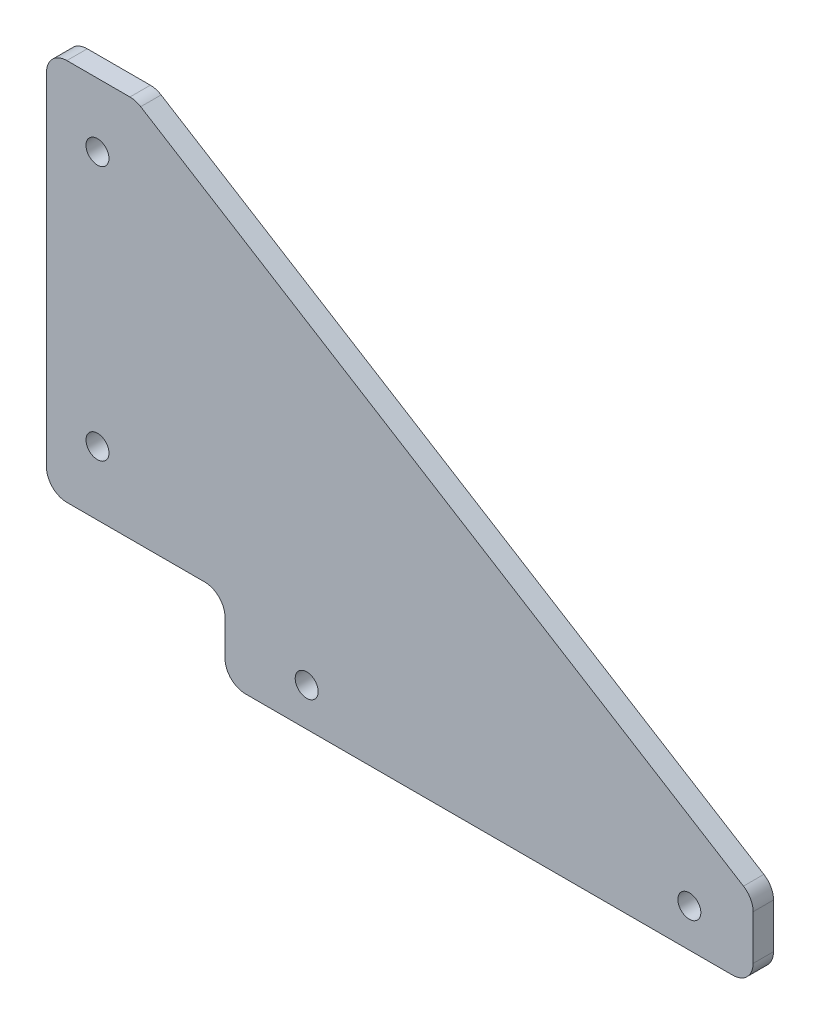
ISO-10303-21;
HEADER;
FILE_DESCRIPTION(('STEP AP214'),'2;1');
FILE_NAME('part.step','',(''),(''),'','','');
FILE_SCHEMA(('AUTOMOTIVE_DESIGN { 1 0 10303 214 1 1 1 1 }'));
ENDSEC;
DATA;
#1=APPLICATION_CONTEXT('core data for automotive mechanical design processes');
#2=APPLICATION_PROTOCOL_DEFINITION('international standard','automotive_design',2000,#1);
#3=PRODUCT_CONTEXT('',#1,'mechanical');
#4=PRODUCT('Part','Part','',(#3));
#5=PRODUCT_RELATED_PRODUCT_CATEGORY('part','',(#4));
#6=PRODUCT_DEFINITION_FORMATION('','',#4);
#7=PRODUCT_DEFINITION_CONTEXT('part definition',#1,'design');
#8=PRODUCT_DEFINITION('design','',#6,#7);
#9=PRODUCT_DEFINITION_SHAPE('','',#8);
#10=(LENGTH_UNIT() NAMED_UNIT(*) SI_UNIT(.MILLI.,.METRE.));
#11=(NAMED_UNIT(*) PLANE_ANGLE_UNIT() SI_UNIT($,.RADIAN.));
#12=(NAMED_UNIT(*) SI_UNIT($,.STERADIAN.) SOLID_ANGLE_UNIT());
#13=UNCERTAINTY_MEASURE_WITH_UNIT(LENGTH_MEASURE(1.E-05),#10,'distance_accuracy_value','');
#14=(GEOMETRIC_REPRESENTATION_CONTEXT(3) GLOBAL_UNCERTAINTY_ASSIGNED_CONTEXT((#13)) GLOBAL_UNIT_ASSIGNED_CONTEXT((#10,
#11,#12)) REPRESENTATION_CONTEXT('',''));
#15=CARTESIAN_POINT('',(0.,0.,0.));
#16=DIRECTION('',(0.,0.,1.));
#17=DIRECTION('',(1.,0.,0.));
#18=AXIS2_PLACEMENT_3D('',#15,#16,#17);
#19=CARTESIAN_POINT('',(-86.6689221257626,123.251708428246,8.));
#20=DIRECTION('',(0.,0.,-1.));
#21=DIRECTION('',(-1.,0.,0.));
#22=AXIS2_PLACEMENT_3D('',#19,#20,#21);
#23=PLANE('',#22);
#24=CARTESIAN_POINT('',(-86.6689221257626,123.251708428246,8.));
#25=DIRECTION('',(0.,0.,1.));
#26=DIRECTION('',(-1.,0.,0.));
#27=AXIS2_PLACEMENT_3D('',#24,#25,#26);
#28=CIRCLE('',#27,8.);
#29=CARTESIAN_POINT('',(-82.4542166522612,130.051433258828,8.));
#30=VERTEX_POINT('',#29);
#31=CARTESIAN_POINT('',(-86.6689221257626,131.251708428246,8.));
#32=VERTEX_POINT('',#31);
#33=EDGE_CURVE('E192',#30,#32,#28,.T.);
#34=ORIENTED_EDGE('',*,*,#33,.T.);
#35=DIRECTION('',(-1.,0.,0.));
#36=VECTOR('',#35,1.);
#37=CARTESIAN_POINT('',(-86.6689221257626,131.251708428246,8.));
#38=LINE('',#37,#36);
#39=CARTESIAN_POINT('',(-111.390660592255,131.251708428246,8.));
#40=VERTEX_POINT('',#39);
#41=EDGE_CURVE('E110',#32,#40,#38,.T.);
#42=ORIENTED_EDGE('',*,*,#41,.T.);
#43=CARTESIAN_POINT('',(-111.390660592255,123.251708428246,8.));
#44=DIRECTION('',(0.,0.,1.));
#45=DIRECTION('',(-1.,0.,0.));
#46=AXIS2_PLACEMENT_3D('',#43,#44,#45);
#47=CIRCLE('',#46,8.);
#48=CARTESIAN_POINT('',(-119.390660592255,123.251708428246,8.));
#49=VERTEX_POINT('',#48);
#50=EDGE_CURVE('E225',#40,#49,#47,.T.);
#51=ORIENTED_EDGE('',*,*,#50,.T.);
#52=DIRECTION('',(0.,-1.,0.));
#53=VECTOR('',#52,1.);
#54=CARTESIAN_POINT('',(-119.390660592255,123.251708428246,8.));
#55=LINE('',#54,#53);
#56=CARTESIAN_POINT('',(-119.390660592255,-10.748291571754,8.));
#57=VERTEX_POINT('',#56);
#58=EDGE_CURVE('E244',#49,#57,#55,.T.);
#59=ORIENTED_EDGE('',*,*,#58,.T.);
#60=CARTESIAN_POINT('',(-111.390660592255,-10.748291571754,8.));
#61=DIRECTION('',(0.,0.,1.));
#62=DIRECTION('',(-1.,0.,0.));
#63=AXIS2_PLACEMENT_3D('',#60,#61,#62);
#64=CIRCLE('',#63,8.00000000000001);
#65=CARTESIAN_POINT('',(-111.390660592255,-18.748291571754,8.));
#66=VERTEX_POINT('',#65);
#67=EDGE_CURVE('E241',#57,#66,#64,.T.);
#68=ORIENTED_EDGE('',*,*,#67,.T.);
#69=DIRECTION('',(1.,0.,0.));
#70=VECTOR('',#69,1.);
#71=CARTESIAN_POINT('',(-111.390660592255,-18.748291571754,8.));
#72=LINE('',#71,#70);
#73=CARTESIAN_POINT('',(-57.3906605922552,-18.748291571754,8.));
#74=VERTEX_POINT('',#73);
#75=EDGE_CURVE('E243',#66,#74,#72,.T.);
#76=ORIENTED_EDGE('',*,*,#75,.T.);
#77=CARTESIAN_POINT('',(-57.3906605922552,-26.748291571754,8.));
#78=DIRECTION('',(0.,0.,-1.));
#79=DIRECTION('',(1.,0.,0.));
#80=AXIS2_PLACEMENT_3D('',#77,#78,#79);
#81=CIRCLE('',#80,8.);
#82=CARTESIAN_POINT('',(-49.3906605922552,-26.748291571754,8.));
#83=VERTEX_POINT('',#82);
#84=EDGE_CURVE('E246',#74,#83,#81,.T.);
#85=ORIENTED_EDGE('',*,*,#84,.T.);
#86=DIRECTION('',(0.,-1.,0.));
#87=VECTOR('',#86,1.);
#88=CARTESIAN_POINT('',(-49.3906605922552,-26.748291571754,8.));
#89=LINE('',#88,#87);
#90=CARTESIAN_POINT('',(-49.3906605922552,-40.748291571754,8.));
#91=VERTEX_POINT('',#90);
#92=EDGE_CURVE('E252',#83,#91,#89,.T.);
#93=ORIENTED_EDGE('',*,*,#92,.T.);
#94=CARTESIAN_POINT('',(-41.3906605922551,-40.748291571754,8.));
#95=DIRECTION('',(0.,0.,1.));
#96=DIRECTION('',(-1.,0.,0.));
#97=AXIS2_PLACEMENT_3D('',#94,#95,#96);
#98=CIRCLE('',#97,8.);
#99=CARTESIAN_POINT('',(-41.3906605922551,-48.748291571754,8.));
#100=VERTEX_POINT('',#99);
#101=EDGE_CURVE('E254',#91,#100,#98,.T.);
#102=ORIENTED_EDGE('',*,*,#101,.T.);
#103=DIRECTION('',(1.,0.,0.));
#104=VECTOR('',#103,1.);
#105=CARTESIAN_POINT('',(-41.3906605922551,-48.748291571754,8.));
#106=LINE('',#105,#104);
#107=CARTESIAN_POINT('',(149.609339407745,-48.748291571754,8.));
#108=VERTEX_POINT('',#107);
#109=EDGE_CURVE('E256',#100,#108,#106,.T.);
#110=ORIENTED_EDGE('',*,*,#109,.T.);
#111=CARTESIAN_POINT('',(149.609339407745,-40.748291571754,8.));
#112=DIRECTION('',(0.,0.,1.));
#113=DIRECTION('',(-1.,0.,0.));
#114=AXIS2_PLACEMENT_3D('',#111,#112,#113);
#115=CIRCLE('',#114,8.);
#116=CARTESIAN_POINT('',(157.609339407745,-40.7482915717539,8.));
#117=VERTEX_POINT('',#116);
#118=EDGE_CURVE('E147',#108,#117,#115,.T.);
#119=ORIENTED_EDGE('',*,*,#118,.T.);
#120=DIRECTION('',(0.,1.,0.));
#121=VECTOR('',#120,1.);
#122=CARTESIAN_POINT('',(157.609339407745,-40.7482915717539,8.));
#123=LINE('',#122,#121);
#124=CARTESIAN_POINT('',(157.609339407745,-23.2017594644239,8.));
#125=VERTEX_POINT('',#124);
#126=EDGE_CURVE('E141',#117,#125,#123,.T.);
#127=ORIENTED_EDGE('',*,*,#126,.T.);
#128=CARTESIAN_POINT('',(149.609339407745,-23.2017594644239,8.));
#129=DIRECTION('',(0.,0.,1.));
#130=DIRECTION('',(-1.,0.,0.));
#131=AXIS2_PLACEMENT_3D('',#128,#129,#130);
#132=CIRCLE('',#131,7.99999999999999);
#133=CARTESIAN_POINT('',(153.824044881246,-16.4020346338417,8.));
#134=VERTEX_POINT('',#133);
#135=EDGE_CURVE('E145',#125,#134,#132,.T.);
#136=ORIENTED_EDGE('',*,*,#135,.T.);
#137=DIRECTION('',(-0.849965603822785,0.526838184187677,0.));
#138=VECTOR('',#137,1.);
#139=CARTESIAN_POINT('',(153.824044881246,-16.4020346338417,8.));
#140=LINE('',#139,#138);
#141=EDGE_CURVE('E49',#134,#30,#140,.T.);
#142=ORIENTED_EDGE('',*,*,#141,.T.);
#143=EDGE_LOOP('',(#34,#42,#51,#59,#68,#76,#85,#93,#102,#110,#119,#127,#136,#142));
#144=FACE_BOUND('',#143,.T.);
#145=CARTESIAN_POINT('',(-99.3906605922552,106.251708428246,8.));
#146=DIRECTION('',(0.,0.,1.));
#147=DIRECTION('',(1.,0.,0.));
#148=AXIS2_PLACEMENT_3D('',#145,#146,#147);
#149=CIRCLE('',#148,4.50000000000001);
#150=CARTESIAN_POINT('',(-94.8906605922552,106.251708428246,8.));
#151=VERTEX_POINT('',#150);
#152=EDGE_CURVE('E169',#151,#151,#149,.T.);
#153=ORIENTED_EDGE('',*,*,#152,.F.);
#154=EDGE_LOOP('',(#153));
#155=FACE_BOUND('',#154,.T.);
#156=CARTESIAN_POINT('',(-99.3906605922552,6.25170842824602,8.));
#157=DIRECTION('',(0.,0.,1.));
#158=DIRECTION('',(1.,0.,0.));
#159=AXIS2_PLACEMENT_3D('',#156,#157,#158);
#160=CIRCLE('',#159,4.5);
#161=CARTESIAN_POINT('',(-94.8906605922551,6.25170842824602,8.));
#162=VERTEX_POINT('',#161);
#163=EDGE_CURVE('E320',#162,#162,#160,.T.);
#164=ORIENTED_EDGE('',*,*,#163,.F.);
#165=EDGE_LOOP('',(#164));
#166=FACE_BOUND('',#165,.T.);
#167=CARTESIAN_POINT('',(-17.3906605922552,-33.748291571754,8.));
#168=DIRECTION('',(0.,0.,1.));
#169=DIRECTION('',(1.,0.,0.));
#170=AXIS2_PLACEMENT_3D('',#167,#168,#169);
#171=CIRCLE('',#170,4.50000000000001);
#172=CARTESIAN_POINT('',(-12.8906605922552,-33.748291571754,8.));
#173=VERTEX_POINT('',#172);
#174=EDGE_CURVE('E314',#173,#173,#171,.T.);
#175=ORIENTED_EDGE('',*,*,#174,.F.);
#176=EDGE_LOOP('',(#175));
#177=FACE_BOUND('',#176,.T.);
#178=CARTESIAN_POINT('',(132.609339407745,-33.748291571754,8.));
#179=DIRECTION('',(0.,0.,1.));
#180=DIRECTION('',(1.,0.,0.));
#181=AXIS2_PLACEMENT_3D('',#178,#179,#180);
#182=CIRCLE('',#181,4.49999999999996);
#183=CARTESIAN_POINT('',(137.109339407745,-33.748291571754,8.));
#184=VERTEX_POINT('',#183);
#185=EDGE_CURVE('E305',#184,#184,#182,.T.);
#186=ORIENTED_EDGE('',*,*,#185,.F.);
#187=EDGE_LOOP('',(#186));
#188=FACE_BOUND('',#187,.T.);
#189=ADVANCED_FACE('F32',(#144,#155,#166,#177,#188),#23,.F.);
#190=CARTESIAN_POINT('',(-86.6689221257626,123.251708428246,0.));
#191=DIRECTION('',(0.,0.,-1.));
#192=DIRECTION('',(-1.,0.,0.));
#193=AXIS2_PLACEMENT_3D('',#190,#191,#192);
#194=PLANE('',#193);
#195=CARTESIAN_POINT('',(-17.3906605922552,-33.748291571754,0.));
#196=DIRECTION('',(0.,0.,1.));
#197=DIRECTION('',(1.,0.,0.));
#198=AXIS2_PLACEMENT_3D('',#195,#196,#197);
#199=CIRCLE('',#198,4.50000000000001);
#200=CARTESIAN_POINT('',(-12.8906605922552,-33.748291571754,0.));
#201=VERTEX_POINT('',#200);
#202=EDGE_CURVE('E311',#201,#201,#199,.T.);
#203=ORIENTED_EDGE('',*,*,#202,.T.);
#204=EDGE_LOOP('',(#203));
#205=FACE_BOUND('',#204,.T.);
#206=CARTESIAN_POINT('',(-99.3906605922552,106.251708428246,0.));
#207=DIRECTION('',(0.,0.,1.));
#208=DIRECTION('',(1.,0.,0.));
#209=AXIS2_PLACEMENT_3D('',#206,#207,#208);
#210=CIRCLE('',#209,4.50000000000001);
#211=CARTESIAN_POINT('',(-94.8906605922552,106.251708428246,0.));
#212=VERTEX_POINT('',#211);
#213=EDGE_CURVE('E323',#212,#212,#210,.T.);
#214=ORIENTED_EDGE('',*,*,#213,.T.);
#215=EDGE_LOOP('',(#214));
#216=FACE_BOUND('',#215,.T.);
#217=CARTESIAN_POINT('',(-86.6689221257626,123.251708428246,0.));
#218=DIRECTION('',(0.,0.,1.));
#219=DIRECTION('',(-1.,0.,0.));
#220=AXIS2_PLACEMENT_3D('',#217,#218,#219);
#221=CIRCLE('',#220,8.);
#222=CARTESIAN_POINT('',(-82.4542166522612,130.051433258828,0.));
#223=VERTEX_POINT('',#222);
#224=CARTESIAN_POINT('',(-86.6689221257626,131.251708428246,0.));
#225=VERTEX_POINT('',#224);
#226=EDGE_CURVE('E165',#223,#225,#221,.T.);
#227=ORIENTED_EDGE('',*,*,#226,.F.);
#228=DIRECTION('',(-0.849965603822785,0.526838184187677,0.));
#229=VECTOR('',#228,1.);
#230=CARTESIAN_POINT('',(153.824044881246,-16.4020346338417,0.));
#231=LINE('',#230,#229);
#232=CARTESIAN_POINT('',(153.824044881246,-16.4020346338417,0.));
#233=VERTEX_POINT('',#232);
#234=EDGE_CURVE('E102',#233,#223,#231,.T.);
#235=ORIENTED_EDGE('',*,*,#234,.F.);
#236=CARTESIAN_POINT('',(149.609339407745,-23.2017594644239,0.));
#237=DIRECTION('',(0.,0.,1.));
#238=DIRECTION('',(-1.,0.,0.));
#239=AXIS2_PLACEMENT_3D('',#236,#237,#238);
#240=CIRCLE('',#239,7.99999999999999);
#241=CARTESIAN_POINT('',(157.609339407745,-23.2017594644239,0.));
#242=VERTEX_POINT('',#241);
#243=EDGE_CURVE('E96',#242,#233,#240,.T.);
#244=ORIENTED_EDGE('',*,*,#243,.F.);
#245=DIRECTION('',(0.,1.,0.));
#246=VECTOR('',#245,1.);
#247=CARTESIAN_POINT('',(157.609339407745,-40.7482915717539,0.));
#248=LINE('',#247,#246);
#249=CARTESIAN_POINT('',(157.609339407745,-40.7482915717539,0.));
#250=VERTEX_POINT('',#249);
#251=EDGE_CURVE('E155',#250,#242,#248,.T.);
#252=ORIENTED_EDGE('',*,*,#251,.F.);
#253=CARTESIAN_POINT('',(149.609339407745,-40.748291571754,0.));
#254=DIRECTION('',(0.,0.,1.));
#255=DIRECTION('',(-1.,0.,0.));
#256=AXIS2_PLACEMENT_3D('',#253,#254,#255);
#257=CIRCLE('',#256,8.);
#258=CARTESIAN_POINT('',(149.609339407745,-48.748291571754,0.));
#259=VERTEX_POINT('',#258);
#260=EDGE_CURVE('E187',#259,#250,#257,.T.);
#261=ORIENTED_EDGE('',*,*,#260,.F.);
#262=DIRECTION('',(1.,0.,0.));
#263=VECTOR('',#262,1.);
#264=CARTESIAN_POINT('',(-41.3906605922551,-48.748291571754,0.));
#265=LINE('',#264,#263);
#266=CARTESIAN_POINT('',(-41.3906605922551,-48.748291571754,0.));
#267=VERTEX_POINT('',#266);
#268=EDGE_CURVE('E185',#267,#259,#265,.T.);
#269=ORIENTED_EDGE('',*,*,#268,.F.);
#270=CARTESIAN_POINT('',(-41.3906605922551,-40.748291571754,0.));
#271=DIRECTION('',(0.,0.,1.));
#272=DIRECTION('',(-1.,0.,0.));
#273=AXIS2_PLACEMENT_3D('',#270,#271,#272);
#274=CIRCLE('',#273,8.);
#275=CARTESIAN_POINT('',(-49.3906605922552,-40.748291571754,0.));
#276=VERTEX_POINT('',#275);
#277=EDGE_CURVE('E183',#276,#267,#274,.T.);
#278=ORIENTED_EDGE('',*,*,#277,.F.);
#279=DIRECTION('',(0.,-1.,0.));
#280=VECTOR('',#279,1.);
#281=CARTESIAN_POINT('',(-49.3906605922552,-26.748291571754,0.));
#282=LINE('',#281,#280);
#283=CARTESIAN_POINT('',(-49.3906605922552,-26.748291571754,0.));
#284=VERTEX_POINT('',#283);
#285=EDGE_CURVE('E181',#284,#276,#282,.T.);
#286=ORIENTED_EDGE('',*,*,#285,.F.);
#287=CARTESIAN_POINT('',(-57.3906605922552,-26.748291571754,0.));
#288=DIRECTION('',(0.,0.,-1.));
#289=DIRECTION('',(1.,0.,0.));
#290=AXIS2_PLACEMENT_3D('',#287,#288,#289);
#291=CIRCLE('',#290,8.);
#292=CARTESIAN_POINT('',(-57.3906605922552,-18.748291571754,0.));
#293=VERTEX_POINT('',#292);
#294=EDGE_CURVE('E179',#293,#284,#291,.T.);
#295=ORIENTED_EDGE('',*,*,#294,.F.);
#296=DIRECTION('',(1.,0.,0.));
#297=VECTOR('',#296,1.);
#298=CARTESIAN_POINT('',(-111.390660592255,-18.748291571754,0.));
#299=LINE('',#298,#297);
#300=CARTESIAN_POINT('',(-111.390660592255,-18.748291571754,0.));
#301=VERTEX_POINT('',#300);
#302=EDGE_CURVE('E177',#301,#293,#299,.T.);
#303=ORIENTED_EDGE('',*,*,#302,.F.);
#304=CARTESIAN_POINT('',(-111.390660592255,-10.748291571754,0.));
#305=DIRECTION('',(0.,0.,1.));
#306=DIRECTION('',(-1.,0.,0.));
#307=AXIS2_PLACEMENT_3D('',#304,#305,#306);
#308=CIRCLE('',#307,8.00000000000001);
#309=CARTESIAN_POINT('',(-119.390660592255,-10.748291571754,0.));
#310=VERTEX_POINT('',#309);
#311=EDGE_CURVE('E175',#310,#301,#308,.T.);
#312=ORIENTED_EDGE('',*,*,#311,.F.);
#313=DIRECTION('',(0.,-1.,0.));
#314=VECTOR('',#313,1.);
#315=CARTESIAN_POINT('',(-119.390660592255,123.251708428246,0.));
#316=LINE('',#315,#314);
#317=CARTESIAN_POINT('',(-119.390660592255,123.251708428246,0.));
#318=VERTEX_POINT('',#317);
#319=EDGE_CURVE('E173',#318,#310,#316,.T.);
#320=ORIENTED_EDGE('',*,*,#319,.F.);
#321=CARTESIAN_POINT('',(-111.390660592255,123.251708428246,0.));
#322=DIRECTION('',(0.,0.,1.));
#323=DIRECTION('',(-1.,0.,0.));
#324=AXIS2_PLACEMENT_3D('',#321,#322,#323);
#325=CIRCLE('',#324,8.);
#326=CARTESIAN_POINT('',(-111.390660592255,131.251708428246,0.));
#327=VERTEX_POINT('',#326);
#328=EDGE_CURVE('E171',#327,#318,#325,.T.);
#329=ORIENTED_EDGE('',*,*,#328,.F.);
#330=DIRECTION('',(-1.,0.,0.));
#331=VECTOR('',#330,1.);
#332=CARTESIAN_POINT('',(-86.6689221257626,131.251708428246,0.));
#333=LINE('',#332,#331);
#334=EDGE_CURVE('E168',#225,#327,#333,.T.);
#335=ORIENTED_EDGE('',*,*,#334,.F.);
#336=EDGE_LOOP('',(#227,#235,#244,#252,#261,#269,#278,#286,#295,#303,#312,#320,#329,#335));
#337=FACE_BOUND('',#336,.T.);
#338=CARTESIAN_POINT('',(-99.3906605922552,6.25170842824602,0.));
#339=DIRECTION('',(0.,0.,1.));
#340=DIRECTION('',(1.,0.,0.));
#341=AXIS2_PLACEMENT_3D('',#338,#339,#340);
#342=CIRCLE('',#341,4.5);
#343=CARTESIAN_POINT('',(-94.8906605922551,6.25170842824602,0.));
#344=VERTEX_POINT('',#343);
#345=EDGE_CURVE('E317',#344,#344,#342,.T.);
#346=ORIENTED_EDGE('',*,*,#345,.T.);
#347=EDGE_LOOP('',(#346));
#348=FACE_BOUND('',#347,.T.);
#349=CARTESIAN_POINT('',(132.609339407745,-33.748291571754,0.));
#350=DIRECTION('',(0.,0.,1.));
#351=DIRECTION('',(1.,0.,0.));
#352=AXIS2_PLACEMENT_3D('',#349,#350,#351);
#353=CIRCLE('',#352,4.49999999999996);
#354=CARTESIAN_POINT('',(137.109339407745,-33.748291571754,0.));
#355=VERTEX_POINT('',#354);
#356=EDGE_CURVE('E308',#355,#355,#353,.T.);
#357=ORIENTED_EDGE('',*,*,#356,.T.);
#358=EDGE_LOOP('',(#357));
#359=FACE_BOUND('',#358,.T.);
#360=ADVANCED_FACE('F229',(#205,#216,#337,#348,#359),#194,.T.);
#361=CARTESIAN_POINT('',(-86.6689221257626,123.251708428246,8.));
#362=DIRECTION('',(0.,0.,-1.));
#363=DIRECTION('',(-1.,0.,0.));
#364=AXIS2_PLACEMENT_3D('',#361,#362,#363);
#365=CYLINDRICAL_SURFACE('',#364,8.);
#366=ORIENTED_EDGE('',*,*,#226,.T.);
#367=DIRECTION('',(0.,0.,-1.));
#368=VECTOR('',#367,1.);
#369=CARTESIAN_POINT('',(-86.6689221257626,131.251708428246,8.));
#370=LINE('',#369,#368);
#371=EDGE_CURVE('E11',#32,#225,#370,.T.);
#372=ORIENTED_EDGE('',*,*,#371,.F.);
#373=ORIENTED_EDGE('',*,*,#33,.F.);
#374=DIRECTION('',(0.,0.,-1.));
#375=VECTOR('',#374,1.);
#376=CARTESIAN_POINT('',(-82.4542166522612,130.051433258828,8.));
#377=LINE('',#376,#375);
#378=EDGE_CURVE('E161',#30,#223,#377,.T.);
#379=ORIENTED_EDGE('',*,*,#378,.T.);
#380=EDGE_LOOP('',(#366,#372,#373,#379));
#381=FACE_BOUND('',#380,.T.);
#382=ADVANCED_FACE('F34',(#381),#365,.T.);
#383=CARTESIAN_POINT('',(-86.6689221257626,131.251708428246,8.));
#384=DIRECTION('',(0.,-1.,0.));
#385=DIRECTION('',(1.,0.,0.));
#386=AXIS2_PLACEMENT_3D('',#383,#384,#385);
#387=PLANE('',#386);
#388=ORIENTED_EDGE('',*,*,#334,.T.);
#389=DIRECTION('',(0.,0.,-1.));
#390=VECTOR('',#389,1.);
#391=CARTESIAN_POINT('',(-111.390660592255,131.251708428246,8.));
#392=LINE('',#391,#390);
#393=EDGE_CURVE('E41',#40,#327,#392,.T.);
#394=ORIENTED_EDGE('',*,*,#393,.F.);
#395=ORIENTED_EDGE('',*,*,#41,.F.);
#396=ORIENTED_EDGE('',*,*,#371,.T.);
#397=EDGE_LOOP('',(#388,#394,#395,#396));
#398=FACE_BOUND('',#397,.T.);
#399=ADVANCED_FACE('F455',(#398),#387,.F.);
#400=CARTESIAN_POINT('',(-111.390660592255,123.251708428246,8.));
#401=DIRECTION('',(0.,0.,-1.));
#402=DIRECTION('',(-1.,0.,0.));
#403=AXIS2_PLACEMENT_3D('',#400,#401,#402);
#404=CYLINDRICAL_SURFACE('',#403,8.);
#405=ORIENTED_EDGE('',*,*,#328,.T.);
#406=DIRECTION('',(0.,0.,-1.));
#407=VECTOR('',#406,1.);
#408=CARTESIAN_POINT('',(-119.390660592255,123.251708428246,8.));
#409=LINE('',#408,#407);
#410=EDGE_CURVE('E217',#49,#318,#409,.T.);
#411=ORIENTED_EDGE('',*,*,#410,.F.);
#412=ORIENTED_EDGE('',*,*,#50,.F.);
#413=ORIENTED_EDGE('',*,*,#393,.T.);
#414=EDGE_LOOP('',(#405,#411,#412,#413));
#415=FACE_BOUND('',#414,.T.);
#416=ADVANCED_FACE('F223',(#415),#404,.T.);
#417=CARTESIAN_POINT('',(-119.390660592255,123.251708428246,8.));
#418=DIRECTION('',(1.,0.,0.));
#419=DIRECTION('',(0.,1.,0.));
#420=AXIS2_PLACEMENT_3D('',#417,#418,#419);
#421=PLANE('',#420);
#422=ORIENTED_EDGE('',*,*,#319,.T.);
#423=DIRECTION('',(0.,0.,-1.));
#424=VECTOR('',#423,1.);
#425=CARTESIAN_POINT('',(-119.390660592255,-10.748291571754,8.));
#426=LINE('',#425,#424);
#427=EDGE_CURVE('E214',#57,#310,#426,.T.);
#428=ORIENTED_EDGE('',*,*,#427,.F.);
#429=ORIENTED_EDGE('',*,*,#58,.F.);
#430=ORIENTED_EDGE('',*,*,#410,.T.);
#431=EDGE_LOOP('',(#422,#428,#429,#430));
#432=FACE_BOUND('',#431,.T.);
#433=ADVANCED_FACE('F235',(#432),#421,.F.);
#434=CARTESIAN_POINT('',(-111.390660592255,-10.748291571754,8.));
#435=DIRECTION('',(0.,0.,-1.));
#436=DIRECTION('',(-1.,0.,0.));
#437=AXIS2_PLACEMENT_3D('',#434,#435,#436);
#438=CYLINDRICAL_SURFACE('',#437,8.00000000000001);
#439=ORIENTED_EDGE('',*,*,#311,.T.);
#440=DIRECTION('',(0.,0.,-1.));
#441=VECTOR('',#440,1.);
#442=CARTESIAN_POINT('',(-111.390660592255,-18.748291571754,8.));
#443=LINE('',#442,#441);
#444=EDGE_CURVE('E211',#66,#301,#443,.T.);
#445=ORIENTED_EDGE('',*,*,#444,.F.);
#446=ORIENTED_EDGE('',*,*,#67,.F.);
#447=ORIENTED_EDGE('',*,*,#427,.T.);
#448=EDGE_LOOP('',(#439,#445,#446,#447));
#449=FACE_BOUND('',#448,.T.);
#450=ADVANCED_FACE('F239',(#449),#438,.T.);
#451=CARTESIAN_POINT('',(-111.390660592255,-18.748291571754,8.));
#452=DIRECTION('',(0.,1.,0.));
#453=DIRECTION('',(0.,0.,1.));
#454=AXIS2_PLACEMENT_3D('',#451,#452,#453);
#455=PLANE('',#454);
#456=ORIENTED_EDGE('',*,*,#302,.T.);
#457=DIRECTION('',(0.,0.,-1.));
#458=VECTOR('',#457,1.);
#459=CARTESIAN_POINT('',(-57.3906605922552,-18.748291571754,8.));
#460=LINE('',#459,#458);
#461=EDGE_CURVE('E208',#74,#293,#460,.T.);
#462=ORIENTED_EDGE('',*,*,#461,.F.);
#463=ORIENTED_EDGE('',*,*,#75,.F.);
#464=ORIENTED_EDGE('',*,*,#444,.T.);
#465=EDGE_LOOP('',(#456,#462,#463,#464));
#466=FACE_BOUND('',#465,.T.);
#467=ADVANCED_FACE('F420',(#466),#455,.F.);
#468=CARTESIAN_POINT('',(-57.3906605922552,-26.748291571754,8.));
#469=DIRECTION('',(0.,0.,-1.));
#470=DIRECTION('',(-1.,0.,0.));
#471=AXIS2_PLACEMENT_3D('',#468,#469,#470);
#472=CYLINDRICAL_SURFACE('',#471,8.);
#473=ORIENTED_EDGE('',*,*,#294,.T.);
#474=DIRECTION('',(0.,0.,-1.));
#475=VECTOR('',#474,1.);
#476=CARTESIAN_POINT('',(-49.3906605922552,-26.748291571754,8.));
#477=LINE('',#476,#475);
#478=EDGE_CURVE('E205',#83,#284,#477,.T.);
#479=ORIENTED_EDGE('',*,*,#478,.F.);
#480=ORIENTED_EDGE('',*,*,#84,.F.);
#481=ORIENTED_EDGE('',*,*,#461,.T.);
#482=EDGE_LOOP('',(#473,#479,#480,#481));
#483=FACE_BOUND('',#482,.T.);
#484=ADVANCED_FACE('F410',(#483),#472,.F.);
#485=CARTESIAN_POINT('',(-49.3906605922552,-26.748291571754,8.));
#486=DIRECTION('',(1.,0.,0.));
#487=DIRECTION('',(0.,0.,-1.));
#488=AXIS2_PLACEMENT_3D('',#485,#486,#487);
#489=PLANE('',#488);
#490=ORIENTED_EDGE('',*,*,#285,.T.);
#491=DIRECTION('',(0.,0.,-1.));
#492=VECTOR('',#491,1.);
#493=CARTESIAN_POINT('',(-49.3906605922552,-40.748291571754,8.));
#494=LINE('',#493,#492);
#495=EDGE_CURVE('E202',#91,#276,#494,.T.);
#496=ORIENTED_EDGE('',*,*,#495,.F.);
#497=ORIENTED_EDGE('',*,*,#92,.F.);
#498=ORIENTED_EDGE('',*,*,#478,.T.);
#499=EDGE_LOOP('',(#490,#496,#497,#498));
#500=FACE_BOUND('',#499,.T.);
#501=ADVANCED_FACE('F400',(#500),#489,.F.);
#502=CARTESIAN_POINT('',(-41.3906605922551,-40.748291571754,8.));
#503=DIRECTION('',(0.,0.,-1.));
#504=DIRECTION('',(-1.,0.,0.));
#505=AXIS2_PLACEMENT_3D('',#502,#503,#504);
#506=CYLINDRICAL_SURFACE('',#505,8.);
#507=ORIENTED_EDGE('',*,*,#277,.T.);
#508=DIRECTION('',(0.,0.,-1.));
#509=VECTOR('',#508,1.);
#510=CARTESIAN_POINT('',(-41.3906605922551,-48.748291571754,8.));
#511=LINE('',#510,#509);
#512=EDGE_CURVE('E199',#100,#267,#511,.T.);
#513=ORIENTED_EDGE('',*,*,#512,.F.);
#514=ORIENTED_EDGE('',*,*,#101,.F.);
#515=ORIENTED_EDGE('',*,*,#495,.T.);
#516=EDGE_LOOP('',(#507,#513,#514,#515));
#517=FACE_BOUND('',#516,.T.);
#518=ADVANCED_FACE('F391',(#517),#506,.T.);
#519=CARTESIAN_POINT('',(-41.3906605922551,-48.748291571754,8.));
#520=DIRECTION('',(0.,1.,0.));
#521=DIRECTION('',(0.,0.,1.));
#522=AXIS2_PLACEMENT_3D('',#519,#520,#521);
#523=PLANE('',#522);
#524=ORIENTED_EDGE('',*,*,#268,.T.);
#525=DIRECTION('',(0.,0.,-1.));
#526=VECTOR('',#525,1.);
#527=CARTESIAN_POINT('',(149.609339407745,-48.748291571754,8.));
#528=LINE('',#527,#526);
#529=EDGE_CURVE('E196',#108,#259,#528,.T.);
#530=ORIENTED_EDGE('',*,*,#529,.F.);
#531=ORIENTED_EDGE('',*,*,#109,.F.);
#532=ORIENTED_EDGE('',*,*,#512,.T.);
#533=EDGE_LOOP('',(#524,#530,#531,#532));
#534=FACE_BOUND('',#533,.T.);
#535=ADVANCED_FACE('F262',(#534),#523,.F.);
#536=CARTESIAN_POINT('',(149.609339407745,-40.748291571754,8.));
#537=DIRECTION('',(0.,0.,-1.));
#538=DIRECTION('',(-1.,0.,0.));
#539=AXIS2_PLACEMENT_3D('',#536,#537,#538);
#540=CYLINDRICAL_SURFACE('',#539,8.);
#541=ORIENTED_EDGE('',*,*,#260,.T.);
#542=DIRECTION('',(0.,0.,-1.));
#543=VECTOR('',#542,1.);
#544=CARTESIAN_POINT('',(157.609339407745,-40.7482915717539,8.));
#545=LINE('',#544,#543);
#546=EDGE_CURVE('E156',#117,#250,#545,.T.);
#547=ORIENTED_EDGE('',*,*,#546,.F.);
#548=ORIENTED_EDGE('',*,*,#118,.F.);
#549=ORIENTED_EDGE('',*,*,#529,.T.);
#550=EDGE_LOOP('',(#541,#547,#548,#549));
#551=FACE_BOUND('',#550,.T.);
#552=ADVANCED_FACE('F266',(#551),#540,.T.);
#553=CARTESIAN_POINT('',(157.609339407745,-40.7482915717539,8.));
#554=DIRECTION('',(-1.,0.,0.));
#555=DIRECTION('',(0.,-1.,0.));
#556=AXIS2_PLACEMENT_3D('',#553,#554,#555);
#557=PLANE('',#556);
#558=ORIENTED_EDGE('',*,*,#251,.T.);
#559=DIRECTION('',(0.,0.,-1.));
#560=VECTOR('',#559,1.);
#561=CARTESIAN_POINT('',(157.609339407745,-23.2017594644239,8.));
#562=LINE('',#561,#560);
#563=EDGE_CURVE('E152',#125,#242,#562,.T.);
#564=ORIENTED_EDGE('',*,*,#563,.F.);
#565=ORIENTED_EDGE('',*,*,#126,.F.);
#566=ORIENTED_EDGE('',*,*,#546,.T.);
#567=EDGE_LOOP('',(#558,#564,#565,#566));
#568=FACE_BOUND('',#567,.T.);
#569=ADVANCED_FACE('F153',(#568),#557,.F.);
#570=CARTESIAN_POINT('',(149.609339407745,-23.2017594644239,8.));
#571=DIRECTION('',(0.,0.,-1.));
#572=DIRECTION('',(-1.,0.,0.));
#573=AXIS2_PLACEMENT_3D('',#570,#571,#572);
#574=CYLINDRICAL_SURFACE('',#573,7.99999999999999);
#575=ORIENTED_EDGE('',*,*,#243,.T.);
#576=DIRECTION('',(0.,0.,-1.));
#577=VECTOR('',#576,1.);
#578=CARTESIAN_POINT('',(153.824044881246,-16.4020346338417,8.));
#579=LINE('',#578,#577);
#580=EDGE_CURVE('E157',#134,#233,#579,.T.);
#581=ORIENTED_EDGE('',*,*,#580,.F.);
#582=ORIENTED_EDGE('',*,*,#135,.F.);
#583=ORIENTED_EDGE('',*,*,#563,.T.);
#584=EDGE_LOOP('',(#575,#581,#582,#583));
#585=FACE_BOUND('',#584,.T.);
#586=ADVANCED_FACE('F159',(#585),#574,.T.);
#587=CARTESIAN_POINT('',(153.824044881246,-16.4020346338417,8.));
#588=DIRECTION('',(-0.526838184187677,-0.849965603822785,0.));
#589=DIRECTION('',(0.849965603822785,-0.526838184187677,0.));
#590=AXIS2_PLACEMENT_3D('',#587,#588,#589);
#591=PLANE('',#590);
#592=ORIENTED_EDGE('',*,*,#234,.T.);
#593=ORIENTED_EDGE('',*,*,#378,.F.);
#594=ORIENTED_EDGE('',*,*,#141,.F.);
#595=ORIENTED_EDGE('',*,*,#580,.T.);
#596=EDGE_LOOP('',(#592,#593,#594,#595));
#597=FACE_BOUND('',#596,.T.);
#598=ADVANCED_FACE('F270',(#597),#591,.F.);
#599=CARTESIAN_POINT('',(-99.3906605922552,106.251708428246,8.));
#600=DIRECTION('',(0.,0.,-1.));
#601=DIRECTION('',(-1.,0.,0.));
#602=AXIS2_PLACEMENT_3D('',#599,#600,#601);
#603=CYLINDRICAL_SURFACE('',#602,4.50000000000001);
#604=ORIENTED_EDGE('',*,*,#152,.T.);
#605=EDGE_LOOP('',(#604));
#606=FACE_BOUND('',#605,.T.);
#607=ORIENTED_EDGE('',*,*,#213,.F.);
#608=EDGE_LOOP('',(#607));
#609=FACE_BOUND('',#608,.T.);
#610=ADVANCED_FACE('F272',(#606,#609),#603,.F.);
#611=CARTESIAN_POINT('',(-99.3906605922552,6.25170842824602,8.));
#612=DIRECTION('',(0.,0.,-1.));
#613=DIRECTION('',(-1.,0.,0.));
#614=AXIS2_PLACEMENT_3D('',#611,#612,#613);
#615=CYLINDRICAL_SURFACE('',#614,4.5);
#616=ORIENTED_EDGE('',*,*,#163,.T.);
#617=EDGE_LOOP('',(#616));
#618=FACE_BOUND('',#617,.T.);
#619=ORIENTED_EDGE('',*,*,#345,.F.);
#620=EDGE_LOOP('',(#619));
#621=FACE_BOUND('',#620,.T.);
#622=ADVANCED_FACE('F278',(#618,#621),#615,.F.);
#623=CARTESIAN_POINT('',(-17.3906605922552,-33.748291571754,8.));
#624=DIRECTION('',(0.,0.,-1.));
#625=DIRECTION('',(-1.,0.,0.));
#626=AXIS2_PLACEMENT_3D('',#623,#624,#625);
#627=CYLINDRICAL_SURFACE('',#626,4.50000000000001);
#628=ORIENTED_EDGE('',*,*,#174,.T.);
#629=EDGE_LOOP('',(#628));
#630=FACE_BOUND('',#629,.T.);
#631=ORIENTED_EDGE('',*,*,#202,.F.);
#632=EDGE_LOOP('',(#631));
#633=FACE_BOUND('',#632,.T.);
#634=ADVANCED_FACE('F292',(#630,#633),#627,.F.);
#635=CARTESIAN_POINT('',(132.609339407745,-33.748291571754,8.));
#636=DIRECTION('',(0.,0.,-1.));
#637=DIRECTION('',(-1.,0.,0.));
#638=AXIS2_PLACEMENT_3D('',#635,#636,#637);
#639=CYLINDRICAL_SURFACE('',#638,4.49999999999996);
#640=ORIENTED_EDGE('',*,*,#185,.T.);
#641=EDGE_LOOP('',(#640));
#642=FACE_BOUND('',#641,.T.);
#643=ORIENTED_EDGE('',*,*,#356,.F.);
#644=EDGE_LOOP('',(#643));
#645=FACE_BOUND('',#644,.T.);
#646=ADVANCED_FACE('F296',(#642,#645),#639,.F.);
#647=CLOSED_SHELL('',(#189,#360,#382,#399,#416,#433,#450,#467,#484,#501,#518,#535,#552,#569,
#586,#598,#610,#622,#634,#646));
#648=MANIFOLD_SOLID_BREP('B2',#647);
#649=ADVANCED_BREP_SHAPE_REPRESENTATION('',(#18,#648),#14);
#650=SHAPE_DEFINITION_REPRESENTATION(#9,#649);
ENDSEC;
END-ISO-10303-21;
